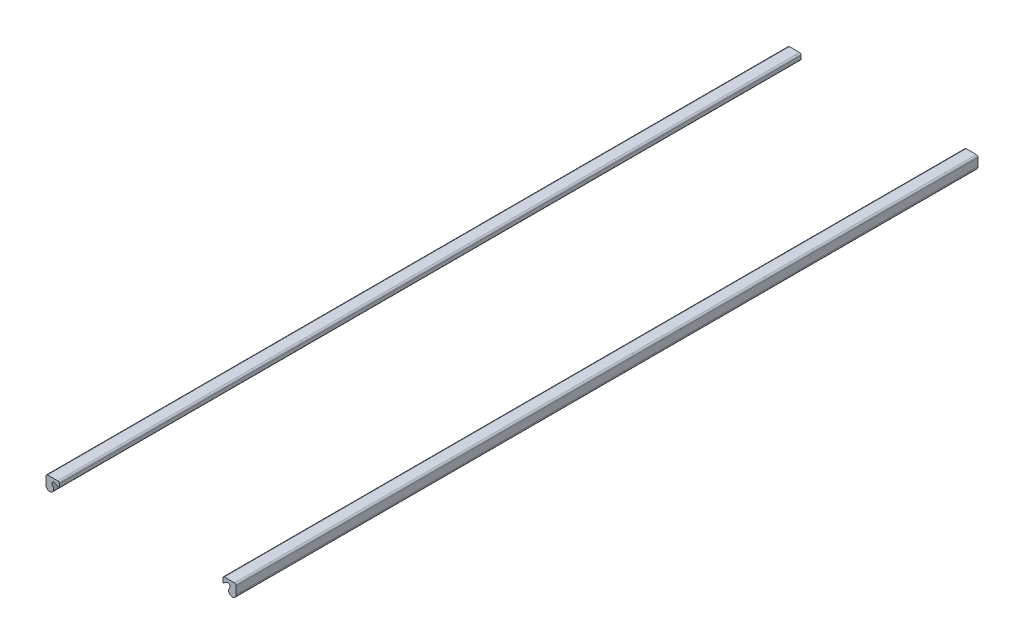
ISO-10303-21;
HEADER;
FILE_DESCRIPTION(('STEP AP214'),'2;1');
FILE_NAME('part.step','',(''),(''),'','','');
FILE_SCHEMA(('AUTOMOTIVE_DESIGN { 1 0 10303 214 1 1 1 1 }'));
ENDSEC;
DATA;
#1=APPLICATION_CONTEXT('core data for automotive mechanical design processes');
#2=APPLICATION_PROTOCOL_DEFINITION('international standard','automotive_design',2000,#1);
#3=PRODUCT_CONTEXT('',#1,'mechanical');
#4=PRODUCT('Part','Part','',(#3));
#5=PRODUCT_RELATED_PRODUCT_CATEGORY('part','',(#4));
#6=PRODUCT_DEFINITION_FORMATION('','',#4);
#7=PRODUCT_DEFINITION_CONTEXT('part definition',#1,'design');
#8=PRODUCT_DEFINITION('design','',#6,#7);
#9=PRODUCT_DEFINITION_SHAPE('','',#8);
#10=(LENGTH_UNIT() NAMED_UNIT(*) SI_UNIT(.MILLI.,.METRE.));
#11=(NAMED_UNIT(*) PLANE_ANGLE_UNIT() SI_UNIT($,.RADIAN.));
#12=(NAMED_UNIT(*) SI_UNIT($,.STERADIAN.) SOLID_ANGLE_UNIT());
#13=UNCERTAINTY_MEASURE_WITH_UNIT(LENGTH_MEASURE(1.E-05),#10,'distance_accuracy_value','');
#14=(GEOMETRIC_REPRESENTATION_CONTEXT(3) GLOBAL_UNCERTAINTY_ASSIGNED_CONTEXT((#13)) GLOBAL_UNIT_ASSIGNED_CONTEXT((#10,
#11,#12)) REPRESENTATION_CONTEXT('',''));
#15=CARTESIAN_POINT('',(0.,0.,0.));
#16=DIRECTION('',(0.,0.,1.));
#17=DIRECTION('',(1.,0.,0.));
#18=AXIS2_PLACEMENT_3D('',#15,#16,#17);
#19=CARTESIAN_POINT('',(6.98,5.18,-27.7));
#20=DIRECTION('',(0.,0.,1.));
#21=DIRECTION('',(1.,0.,0.));
#22=AXIS2_PLACEMENT_3D('',#19,#20,#21);
#23=CYLINDRICAL_SURFACE('',#22,0.12);
#24=CARTESIAN_POINT('',(6.98,5.18,27.7));
#25=DIRECTION('',(0.,0.,1.));
#26=DIRECTION('',(-1.,0.,0.));
#27=AXIS2_PLACEMENT_3D('',#24,#25,#26);
#28=CIRCLE('',#27,0.12);
#29=CARTESIAN_POINT('',(7.1,5.18,27.7));
#30=VERTEX_POINT('',#29);
#31=CARTESIAN_POINT('',(6.98,5.3,27.7));
#32=VERTEX_POINT('',#31);
#33=EDGE_CURVE('E174',#30,#32,#28,.T.);
#34=ORIENTED_EDGE('',*,*,#33,.F.);
#35=DIRECTION('',(0.,0.,1.));
#36=VECTOR('',#35,1.);
#37=CARTESIAN_POINT('',(7.1,5.18,-27.7));
#38=LINE('',#37,#36);
#39=CARTESIAN_POINT('',(7.1,5.18,-27.7));
#40=VERTEX_POINT('',#39);
#41=EDGE_CURVE('E12',#40,#30,#38,.T.);
#42=ORIENTED_EDGE('',*,*,#41,.F.);
#43=CARTESIAN_POINT('',(6.98,5.18,-27.7));
#44=DIRECTION('',(0.,0.,1.));
#45=DIRECTION('',(-1.,0.,0.));
#46=AXIS2_PLACEMENT_3D('',#43,#44,#45);
#47=CIRCLE('',#46,0.12);
#48=CARTESIAN_POINT('',(6.98,5.3,-27.7));
#49=VERTEX_POINT('',#48);
#50=EDGE_CURVE('E185',#40,#49,#47,.T.);
#51=ORIENTED_EDGE('',*,*,#50,.T.);
#52=DIRECTION('',(0.,0.,1.));
#53=VECTOR('',#52,1.);
#54=CARTESIAN_POINT('',(6.98,5.3,-27.7));
#55=LINE('',#54,#53);
#56=EDGE_CURVE('E55',#49,#32,#55,.T.);
#57=ORIENTED_EDGE('',*,*,#56,.T.);
#58=EDGE_LOOP('',(#34,#42,#51,#57));
#59=FACE_BOUND('',#58,.T.);
#60=ADVANCED_FACE('F47',(#59),#23,.T.);
#61=CARTESIAN_POINT('',(7.1,4.58284271247461,-27.7));
#62=DIRECTION('',(1.,0.,0.));
#63=DIRECTION('',(0.,1.,0.));
#64=AXIS2_PLACEMENT_3D('',#61,#62,#63);
#65=PLANE('',#64);
#66=DIRECTION('',(0.,1.,0.));
#67=VECTOR('',#66,1.);
#68=CARTESIAN_POINT('',(7.1,4.58284271247461,27.7));
#69=LINE('',#68,#67);
#70=CARTESIAN_POINT('',(7.1,4.58284271247461,27.7));
#71=VERTEX_POINT('',#70);
#72=EDGE_CURVE('E181',#71,#30,#69,.T.);
#73=ORIENTED_EDGE('',*,*,#72,.F.);
#74=DIRECTION('',(0.,0.,1.));
#75=VECTOR('',#74,1.);
#76=CARTESIAN_POINT('',(7.1,4.58284271247461,-27.7));
#77=LINE('',#76,#75);
#78=CARTESIAN_POINT('',(7.1,4.58284271247461,-27.7));
#79=VERTEX_POINT('',#78);
#80=EDGE_CURVE('E59',#79,#71,#77,.T.);
#81=ORIENTED_EDGE('',*,*,#80,.F.);
#82=DIRECTION('',(0.,1.,0.));
#83=VECTOR('',#82,1.);
#84=CARTESIAN_POINT('',(7.1,4.58284271247461,-27.7));
#85=LINE('',#84,#83);
#86=EDGE_CURVE('E137',#79,#40,#85,.T.);
#87=ORIENTED_EDGE('',*,*,#86,.T.);
#88=ORIENTED_EDGE('',*,*,#41,.T.);
#89=EDGE_LOOP('',(#73,#81,#87,#88));
#90=FACE_BOUND('',#89,.T.);
#91=ADVANCED_FACE('F167',(#90),#65,.T.);
#92=CARTESIAN_POINT('',(6.81715728752539,4.58284271247461,-27.7));
#93=DIRECTION('',(0.,0.,1.));
#94=DIRECTION('',(1.,0.,0.));
#95=AXIS2_PLACEMENT_3D('',#92,#93,#94);
#96=CYLINDRICAL_SURFACE('',#95,0.282842712474614);
#97=CARTESIAN_POINT('',(6.81715728752539,4.58284271247461,27.7));
#98=DIRECTION('',(0.,0.,1.));
#99=DIRECTION('',(1.,0.,0.));
#100=AXIS2_PLACEMENT_3D('',#97,#98,#99);
#101=CIRCLE('',#100,0.282842712474614);
#102=CARTESIAN_POINT('',(6.57812257285704,4.73404590418504,27.7));
#103=VERTEX_POINT('',#102);
#104=EDGE_CURVE('E124',#103,#71,#101,.T.);
#105=ORIENTED_EDGE('',*,*,#104,.F.);
#106=DIRECTION('',(0.,0.,1.));
#107=VECTOR('',#106,1.);
#108=CARTESIAN_POINT('',(6.57812257285704,4.73404590418504,-27.7));
#109=LINE('',#108,#107);
#110=CARTESIAN_POINT('',(6.57812257285704,4.73404590418504,-27.7));
#111=VERTEX_POINT('',#110);
#112=EDGE_CURVE('E117',#111,#103,#109,.T.);
#113=ORIENTED_EDGE('',*,*,#112,.F.);
#114=CARTESIAN_POINT('',(6.81715728752539,4.58284271247461,-27.7));
#115=DIRECTION('',(0.,0.,1.));
#116=DIRECTION('',(1.,0.,0.));
#117=AXIS2_PLACEMENT_3D('',#114,#115,#116);
#118=CIRCLE('',#117,0.282842712474614);
#119=EDGE_CURVE('E122',#111,#79,#118,.T.);
#120=ORIENTED_EDGE('',*,*,#119,.T.);
#121=ORIENTED_EDGE('',*,*,#80,.T.);
#122=EDGE_LOOP('',(#105,#113,#120,#121));
#123=FACE_BOUND('',#122,.T.);
#124=ADVANCED_FACE('F119',(#123),#96,.T.);
#125=CARTESIAN_POINT('',(6.35584262951989,4.77493092469122,-27.7));
#126=DIRECTION('',(0.,0.,-1.));
#127=DIRECTION('',(-0.707106781186541,-0.707106781186554,0.));
#128=AXIS2_PLACEMENT_3D('',#125,#126,#127);
#129=ELLIPSE('',#128,0.35,0.2);
#130=DIRECTION('',(0.,0.,1.));
#131=VECTOR('',#130,1.);
#132=SURFACE_OF_LINEAR_EXTRUSION('',#129,#131);
#133=CARTESIAN_POINT('',(6.35584262951989,4.77493092469122,27.7));
#134=DIRECTION('',(0.,0.,-1.));
#135=DIRECTION('',(-0.707106781186541,-0.707106781186554,0.));
#136=AXIS2_PLACEMENT_3D('',#133,#134,#135);
#137=ELLIPSE('',#136,0.35,0.2);
#138=CARTESIAN_POINT('',(6.18755749223973,4.88770409125084,27.7));
#139=VERTEX_POINT('',#138);
#140=EDGE_CURVE('E187',#139,#103,#137,.T.);
#141=ORIENTED_EDGE('',*,*,#140,.F.);
#142=DIRECTION('',(0.,0.,1.));
#143=VECTOR('',#142,1.);
#144=CARTESIAN_POINT('',(6.18755749223973,4.88770409125084,-27.7));
#145=LINE('',#144,#143);
#146=CARTESIAN_POINT('',(6.18755749223973,4.88770409125084,-27.7));
#147=VERTEX_POINT('',#146);
#148=EDGE_CURVE('E127',#147,#139,#145,.T.);
#149=ORIENTED_EDGE('',*,*,#148,.F.);
#150=EDGE_CURVE('E133',#147,#111,#129,.T.);
#151=ORIENTED_EDGE('',*,*,#150,.T.);
#152=ORIENTED_EDGE('',*,*,#112,.T.);
#153=EDGE_LOOP('',(#141,#149,#151,#152));
#154=FACE_BOUND('',#153,.T.);
#155=ADVANCED_FACE('F139',(#154),#132,.T.);
#156=CARTESIAN_POINT('',(6.15,4.92071067811866,-27.7));
#157=DIRECTION('',(0.,0.,1.));
#158=DIRECTION('',(1.,0.,0.));
#159=AXIS2_PLACEMENT_3D('',#156,#157,#158);
#160=CYLINDRICAL_SURFACE('',#159,0.0500000000000011);
#161=CARTESIAN_POINT('',(6.15,4.92071067811866,27.7));
#162=DIRECTION('',(0.,0.,1.));
#163=DIRECTION('',(1.,0.,0.));
#164=AXIS2_PLACEMENT_3D('',#161,#162,#163);
#165=CIRCLE('',#164,0.0500000000000011);
#166=CARTESIAN_POINT('',(6.1,4.92071067811866,27.7));
#167=VERTEX_POINT('',#166);
#168=EDGE_CURVE('E203',#167,#139,#165,.T.);
#169=ORIENTED_EDGE('',*,*,#168,.F.);
#170=DIRECTION('',(0.,0.,1.));
#171=VECTOR('',#170,1.);
#172=CARTESIAN_POINT('',(6.1,4.92071067811866,-27.7));
#173=LINE('',#172,#171);
#174=CARTESIAN_POINT('',(6.1,4.92071067811866,-27.7));
#175=VERTEX_POINT('',#174);
#176=EDGE_CURVE('E195',#175,#167,#173,.T.);
#177=ORIENTED_EDGE('',*,*,#176,.F.);
#178=CARTESIAN_POINT('',(6.15,4.92071067811866,-27.7));
#179=DIRECTION('',(0.,0.,1.));
#180=DIRECTION('',(1.,0.,0.));
#181=AXIS2_PLACEMENT_3D('',#178,#179,#180);
#182=CIRCLE('',#181,0.0500000000000011);
#183=EDGE_CURVE('E136',#175,#147,#182,.T.);
#184=ORIENTED_EDGE('',*,*,#183,.T.);
#185=ORIENTED_EDGE('',*,*,#148,.T.);
#186=EDGE_LOOP('',(#169,#177,#184,#185));
#187=FACE_BOUND('',#186,.T.);
#188=ADVANCED_FACE('F149',(#187),#160,.T.);
#189=CARTESIAN_POINT('',(6.1,5.18,-27.7));
#190=DIRECTION('',(-1.,0.,0.));
#191=DIRECTION('',(0.,-1.,0.));
#192=AXIS2_PLACEMENT_3D('',#189,#190,#191);
#193=PLANE('',#192);
#194=DIRECTION('',(0.,-1.,0.));
#195=VECTOR('',#194,1.);
#196=CARTESIAN_POINT('',(6.1,5.18,27.7));
#197=LINE('',#196,#195);
#198=CARTESIAN_POINT('',(6.1,5.18,27.7));
#199=VERTEX_POINT('',#198);
#200=EDGE_CURVE('E205',#199,#167,#197,.T.);
#201=ORIENTED_EDGE('',*,*,#200,.F.);
#202=DIRECTION('',(0.,0.,1.));
#203=VECTOR('',#202,1.);
#204=CARTESIAN_POINT('',(6.1,5.18,-27.7));
#205=LINE('',#204,#203);
#206=CARTESIAN_POINT('',(6.1,5.18,-27.7));
#207=VERTEX_POINT('',#206);
#208=EDGE_CURVE('E193',#207,#199,#205,.T.);
#209=ORIENTED_EDGE('',*,*,#208,.F.);
#210=DIRECTION('',(0.,-1.,0.));
#211=VECTOR('',#210,1.);
#212=CARTESIAN_POINT('',(6.1,5.18,-27.7));
#213=LINE('',#212,#211);
#214=EDGE_CURVE('E142',#207,#175,#213,.T.);
#215=ORIENTED_EDGE('',*,*,#214,.T.);
#216=ORIENTED_EDGE('',*,*,#176,.T.);
#217=EDGE_LOOP('',(#201,#209,#215,#216));
#218=FACE_BOUND('',#217,.T.);
#219=ADVANCED_FACE('F155',(#218),#193,.T.);
#220=CARTESIAN_POINT('',(6.22,5.18,-27.7));
#221=DIRECTION('',(0.,0.,1.));
#222=DIRECTION('',(1.,0.,0.));
#223=AXIS2_PLACEMENT_3D('',#220,#221,#222);
#224=CYLINDRICAL_SURFACE('',#223,0.119999999999999);
#225=CARTESIAN_POINT('',(6.22,5.18,27.7));
#226=DIRECTION('',(0.,0.,1.));
#227=DIRECTION('',(-1.,0.,0.));
#228=AXIS2_PLACEMENT_3D('',#225,#226,#227);
#229=CIRCLE('',#228,0.119999999999999);
#230=CARTESIAN_POINT('',(6.22,5.3,27.7));
#231=VERTEX_POINT('',#230);
#232=EDGE_CURVE('E198',#231,#199,#229,.T.);
#233=ORIENTED_EDGE('',*,*,#232,.F.);
#234=DIRECTION('',(0.,0.,1.));
#235=VECTOR('',#234,1.);
#236=CARTESIAN_POINT('',(6.22,5.3,-27.7));
#237=LINE('',#236,#235);
#238=CARTESIAN_POINT('',(6.22,5.3,-27.7));
#239=VERTEX_POINT('',#238);
#240=EDGE_CURVE('E194',#239,#231,#237,.T.);
#241=ORIENTED_EDGE('',*,*,#240,.F.);
#242=CARTESIAN_POINT('',(6.22,5.18,-27.7));
#243=DIRECTION('',(0.,0.,1.));
#244=DIRECTION('',(-1.,0.,0.));
#245=AXIS2_PLACEMENT_3D('',#242,#243,#244);
#246=CIRCLE('',#245,0.119999999999999);
#247=EDGE_CURVE('E212',#239,#207,#246,.T.);
#248=ORIENTED_EDGE('',*,*,#247,.T.);
#249=ORIENTED_EDGE('',*,*,#208,.T.);
#250=EDGE_LOOP('',(#233,#241,#248,#249));
#251=FACE_BOUND('',#250,.T.);
#252=ADVANCED_FACE('F158',(#251),#224,.T.);
#253=CARTESIAN_POINT('',(6.98,5.3,-27.7));
#254=DIRECTION('',(0.,1.,0.));
#255=DIRECTION('',(-1.,0.,0.));
#256=AXIS2_PLACEMENT_3D('',#253,#254,#255);
#257=PLANE('',#256);
#258=DIRECTION('',(-1.,0.,0.));
#259=VECTOR('',#258,1.);
#260=CARTESIAN_POINT('',(6.98,5.3,27.7));
#261=LINE('',#260,#259);
#262=EDGE_CURVE('E177',#32,#231,#261,.T.);
#263=ORIENTED_EDGE('',*,*,#262,.F.);
#264=ORIENTED_EDGE('',*,*,#56,.F.);
#265=DIRECTION('',(-1.,0.,0.));
#266=VECTOR('',#265,1.);
#267=CARTESIAN_POINT('',(6.98,5.3,-27.7));
#268=LINE('',#267,#266);
#269=EDGE_CURVE('E183',#49,#239,#268,.T.);
#270=ORIENTED_EDGE('',*,*,#269,.T.);
#271=ORIENTED_EDGE('',*,*,#240,.T.);
#272=EDGE_LOOP('',(#263,#264,#270,#271));
#273=FACE_BOUND('',#272,.T.);
#274=ADVANCED_FACE('F163',(#273),#257,.T.);
#275=CARTESIAN_POINT('',(6.35584262951989,4.77493092469122,-27.7));
#276=DIRECTION('',(0.,0.,1.));
#277=DIRECTION('',(1.,0.,0.));
#278=AXIS2_PLACEMENT_3D('',#275,#276,#277);
#279=PLANE('',#278);
#280=ORIENTED_EDGE('',*,*,#50,.F.);
#281=ORIENTED_EDGE('',*,*,#86,.F.);
#282=ORIENTED_EDGE('',*,*,#119,.F.);
#283=ORIENTED_EDGE('',*,*,#150,.F.);
#284=ORIENTED_EDGE('',*,*,#183,.F.);
#285=ORIENTED_EDGE('',*,*,#214,.F.);
#286=ORIENTED_EDGE('',*,*,#247,.F.);
#287=ORIENTED_EDGE('',*,*,#269,.F.);
#288=EDGE_LOOP('',(#280,#281,#282,#283,#284,#285,#286,#287));
#289=FACE_BOUND('',#288,.T.);
#290=ADVANCED_FACE('F132',(#289),#279,.F.);
#291=CARTESIAN_POINT('',(6.35584262951989,4.77493092469122,27.7));
#292=DIRECTION('',(0.,0.,1.));
#293=DIRECTION('',(1.,0.,0.));
#294=AXIS2_PLACEMENT_3D('',#291,#292,#293);
#295=PLANE('',#294);
#296=ORIENTED_EDGE('',*,*,#33,.T.);
#297=ORIENTED_EDGE('',*,*,#262,.T.);
#298=ORIENTED_EDGE('',*,*,#232,.T.);
#299=ORIENTED_EDGE('',*,*,#200,.T.);
#300=ORIENTED_EDGE('',*,*,#168,.T.);
#301=ORIENTED_EDGE('',*,*,#140,.T.);
#302=ORIENTED_EDGE('',*,*,#104,.T.);
#303=ORIENTED_EDGE('',*,*,#72,.T.);
#304=EDGE_LOOP('',(#296,#297,#298,#299,#300,#301,#302,#303));
#305=FACE_BOUND('',#304,.T.);
#306=ADVANCED_FACE('F170',(#305),#295,.T.);
#307=CLOSED_SHELL('',(#60,#91,#124,#155,#188,#219,#252,#274,#290,#306));
#308=MANIFOLD_SOLID_BREP('B2',#307);
#309=CARTESIAN_POINT('',(-6.15,4.92071067811866,-27.7));
#310=DIRECTION('',(0.,0.,1.));
#311=DIRECTION('',(1.,0.,0.));
#312=AXIS2_PLACEMENT_3D('',#309,#310,#311);
#313=CYLINDRICAL_SURFACE('',#312,0.0500000000000011);
#314=CARTESIAN_POINT('',(-6.15,4.92071067811866,27.7));
#315=DIRECTION('',(0.,0.,1.));
#316=DIRECTION('',(-1.,0.,0.));
#317=AXIS2_PLACEMENT_3D('',#314,#315,#316);
#318=CIRCLE('',#317,0.0500000000000011);
#319=CARTESIAN_POINT('',(-6.18755749223973,4.88770409125084,27.7));
#320=VERTEX_POINT('',#319);
#321=CARTESIAN_POINT('',(-6.1,4.92071067811866,27.7));
#322=VERTEX_POINT('',#321);
#323=EDGE_CURVE('E358',#320,#322,#318,.T.);
#324=ORIENTED_EDGE('',*,*,#323,.F.);
#325=DIRECTION('',(0.,0.,1.));
#326=VECTOR('',#325,1.);
#327=CARTESIAN_POINT('',(-6.18755749223973,4.88770409125084,-27.7));
#328=LINE('',#327,#326);
#329=CARTESIAN_POINT('',(-6.18755749223973,4.88770409125084,-27.7));
#330=VERTEX_POINT('',#329);
#331=EDGE_CURVE('E50',#330,#320,#328,.T.);
#332=ORIENTED_EDGE('',*,*,#331,.F.);
#333=CARTESIAN_POINT('',(-6.15,4.92071067811866,-27.7));
#334=DIRECTION('',(0.,0.,1.));
#335=DIRECTION('',(-1.,0.,0.));
#336=AXIS2_PLACEMENT_3D('',#333,#334,#335);
#337=CIRCLE('',#336,0.0500000000000011);
#338=CARTESIAN_POINT('',(-6.1,4.92071067811866,-27.7));
#339=VERTEX_POINT('',#338);
#340=EDGE_CURVE('E393',#330,#339,#337,.T.);
#341=ORIENTED_EDGE('',*,*,#340,.T.);
#342=DIRECTION('',(0.,0.,1.));
#343=VECTOR('',#342,1.);
#344=CARTESIAN_POINT('',(-6.1,4.92071067811866,-27.7));
#345=LINE('',#344,#343);
#346=EDGE_CURVE('E261',#339,#322,#345,.T.);
#347=ORIENTED_EDGE('',*,*,#346,.T.);
#348=EDGE_LOOP('',(#324,#332,#341,#347));
#349=FACE_BOUND('',#348,.T.);
#350=ADVANCED_FACE('F257',(#349),#313,.T.);
#351=CARTESIAN_POINT('',(-6.35584262951989,4.77493092469122,-27.7));
#352=DIRECTION('',(0.,0.,-1.));
#353=DIRECTION('',(0.707106781186541,-0.707106781186554,0.));
#354=AXIS2_PLACEMENT_3D('',#351,#352,#353);
#355=ELLIPSE('',#354,0.35,0.2);
#356=DIRECTION('',(0.,0.,1.));
#357=VECTOR('',#356,1.);
#358=SURFACE_OF_LINEAR_EXTRUSION('',#355,#357);
#359=CARTESIAN_POINT('',(-6.35584262951989,4.77493092469122,27.7));
#360=DIRECTION('',(0.,0.,-1.));
#361=DIRECTION('',(0.707106781186541,-0.707106781186554,0.));
#362=AXIS2_PLACEMENT_3D('',#359,#360,#361);
#363=ELLIPSE('',#362,0.35,0.2);
#364=CARTESIAN_POINT('',(-6.57812257285704,4.73404590418504,27.7));
#365=VERTEX_POINT('',#364);
#366=EDGE_CURVE('E394',#365,#320,#363,.T.);
#367=ORIENTED_EDGE('',*,*,#366,.F.);
#368=DIRECTION('',(0.,0.,1.));
#369=VECTOR('',#368,1.);
#370=CARTESIAN_POINT('',(-6.57812257285704,4.73404590418504,-27.7));
#371=LINE('',#370,#369);
#372=CARTESIAN_POINT('',(-6.57812257285704,4.73404590418504,-27.7));
#373=VERTEX_POINT('',#372);
#374=EDGE_CURVE('E270',#373,#365,#371,.T.);
#375=ORIENTED_EDGE('',*,*,#374,.F.);
#376=EDGE_CURVE('E344',#373,#330,#355,.T.);
#377=ORIENTED_EDGE('',*,*,#376,.T.);
#378=ORIENTED_EDGE('',*,*,#331,.T.);
#379=EDGE_LOOP('',(#367,#375,#377,#378));
#380=FACE_BOUND('',#379,.T.);
#381=ADVANCED_FACE('F360',(#380),#358,.T.);
#382=CARTESIAN_POINT('',(-6.81715728752539,4.58284271247461,-27.7));
#383=DIRECTION('',(0.,0.,1.));
#384=DIRECTION('',(1.,0.,0.));
#385=AXIS2_PLACEMENT_3D('',#382,#383,#384);
#386=CYLINDRICAL_SURFACE('',#385,0.282842712474614);
#387=CARTESIAN_POINT('',(-6.81715728752539,4.58284271247461,27.7));
#388=DIRECTION('',(0.,0.,1.));
#389=DIRECTION('',(-1.,0.,0.));
#390=AXIS2_PLACEMENT_3D('',#387,#388,#389);
#391=CIRCLE('',#390,0.282842712474614);
#392=CARTESIAN_POINT('',(-7.1,4.58284271247461,27.7));
#393=VERTEX_POINT('',#392);
#394=EDGE_CURVE('E335',#393,#365,#391,.T.);
#395=ORIENTED_EDGE('',*,*,#394,.F.);
#396=DIRECTION('',(0.,0.,1.));
#397=VECTOR('',#396,1.);
#398=CARTESIAN_POINT('',(-7.1,4.58284271247461,-27.7));
#399=LINE('',#398,#397);
#400=CARTESIAN_POINT('',(-7.1,4.58284271247461,-27.7));
#401=VERTEX_POINT('',#400);
#402=EDGE_CURVE('E327',#401,#393,#399,.T.);
#403=ORIENTED_EDGE('',*,*,#402,.F.);
#404=CARTESIAN_POINT('',(-6.81715728752539,4.58284271247461,-27.7));
#405=DIRECTION('',(0.,0.,1.));
#406=DIRECTION('',(-1.,0.,0.));
#407=AXIS2_PLACEMENT_3D('',#404,#405,#406);
#408=CIRCLE('',#407,0.282842712474614);
#409=EDGE_CURVE('E330',#401,#373,#408,.T.);
#410=ORIENTED_EDGE('',*,*,#409,.T.);
#411=ORIENTED_EDGE('',*,*,#374,.T.);
#412=EDGE_LOOP('',(#395,#403,#410,#411));
#413=FACE_BOUND('',#412,.T.);
#414=ADVANCED_FACE('F328',(#413),#386,.T.);
#415=CARTESIAN_POINT('',(-7.1,4.58284271247461,-27.7));
#416=DIRECTION('',(-1.,0.,0.));
#417=DIRECTION('',(0.,-1.,0.));
#418=AXIS2_PLACEMENT_3D('',#415,#416,#417);
#419=PLANE('',#418);
#420=DIRECTION('',(0.,-1.,0.));
#421=VECTOR('',#420,1.);
#422=CARTESIAN_POINT('',(-7.1,4.58284271247461,27.7));
#423=LINE('',#422,#421);
#424=CARTESIAN_POINT('',(-7.1,5.18,27.7));
#425=VERTEX_POINT('',#424);
#426=EDGE_CURVE('E399',#425,#393,#423,.T.);
#427=ORIENTED_EDGE('',*,*,#426,.F.);
#428=DIRECTION('',(0.,0.,1.));
#429=VECTOR('',#428,1.);
#430=CARTESIAN_POINT('',(-7.1,5.18,-27.7));
#431=LINE('',#430,#429);
#432=CARTESIAN_POINT('',(-7.1,5.18,-27.7));
#433=VERTEX_POINT('',#432);
#434=EDGE_CURVE('E340',#433,#425,#431,.T.);
#435=ORIENTED_EDGE('',*,*,#434,.F.);
#436=DIRECTION('',(0.,-1.,0.));
#437=VECTOR('',#436,1.);
#438=CARTESIAN_POINT('',(-7.1,4.58284271247461,-27.7));
#439=LINE('',#438,#437);
#440=EDGE_CURVE('E342',#433,#401,#439,.T.);
#441=ORIENTED_EDGE('',*,*,#440,.T.);
#442=ORIENTED_EDGE('',*,*,#402,.T.);
#443=EDGE_LOOP('',(#427,#435,#441,#442));
#444=FACE_BOUND('',#443,.T.);
#445=ADVANCED_FACE('F349',(#444),#419,.T.);
#446=CARTESIAN_POINT('',(-6.98,5.18,-27.7));
#447=DIRECTION('',(0.,0.,1.));
#448=DIRECTION('',(1.,0.,0.));
#449=AXIS2_PLACEMENT_3D('',#446,#447,#448);
#450=CYLINDRICAL_SURFACE('',#449,0.12);
#451=CARTESIAN_POINT('',(-6.98,5.18,27.7));
#452=DIRECTION('',(0.,0.,1.));
#453=DIRECTION('',(1.,0.,0.));
#454=AXIS2_PLACEMENT_3D('',#451,#452,#453);
#455=CIRCLE('',#454,0.12);
#456=CARTESIAN_POINT('',(-6.98,5.3,27.7));
#457=VERTEX_POINT('',#456);
#458=EDGE_CURVE('E419',#457,#425,#455,.T.);
#459=ORIENTED_EDGE('',*,*,#458,.F.);
#460=DIRECTION('',(0.,0.,1.));
#461=VECTOR('',#460,1.);
#462=CARTESIAN_POINT('',(-6.98,5.3,-27.7));
#463=LINE('',#462,#461);
#464=CARTESIAN_POINT('',(-6.98,5.3,-27.7));
#465=VERTEX_POINT('',#464);
#466=EDGE_CURVE('E404',#465,#457,#463,.T.);
#467=ORIENTED_EDGE('',*,*,#466,.F.);
#468=CARTESIAN_POINT('',(-6.98,5.18,-27.7));
#469=DIRECTION('',(0.,0.,1.));
#470=DIRECTION('',(1.,0.,0.));
#471=AXIS2_PLACEMENT_3D('',#468,#469,#470);
#472=CIRCLE('',#471,0.12);
#473=EDGE_CURVE('E347',#465,#433,#472,.T.);
#474=ORIENTED_EDGE('',*,*,#473,.T.);
#475=ORIENTED_EDGE('',*,*,#434,.T.);
#476=EDGE_LOOP('',(#459,#467,#474,#475));
#477=FACE_BOUND('',#476,.T.);
#478=ADVANCED_FACE('F367',(#477),#450,.T.);
#479=CARTESIAN_POINT('',(-6.98,5.3,-27.7));
#480=DIRECTION('',(0.,1.,0.));
#481=DIRECTION('',(-1.,0.,0.));
#482=AXIS2_PLACEMENT_3D('',#479,#480,#481);
#483=PLANE('',#482);
#484=DIRECTION('',(-1.,0.,0.));
#485=VECTOR('',#484,1.);
#486=CARTESIAN_POINT('',(-6.98,5.3,27.7));
#487=LINE('',#486,#485);
#488=CARTESIAN_POINT('',(-6.22,5.3,27.7));
#489=VERTEX_POINT('',#488);
#490=EDGE_CURVE('E411',#489,#457,#487,.T.);
#491=ORIENTED_EDGE('',*,*,#490,.F.);
#492=DIRECTION('',(0.,0.,1.));
#493=VECTOR('',#492,1.);
#494=CARTESIAN_POINT('',(-6.22,5.3,-27.7));
#495=LINE('',#494,#493);
#496=CARTESIAN_POINT('',(-6.22,5.3,-27.7));
#497=VERTEX_POINT('',#496);
#498=EDGE_CURVE('E406',#497,#489,#495,.T.);
#499=ORIENTED_EDGE('',*,*,#498,.F.);
#500=DIRECTION('',(-1.,0.,0.));
#501=VECTOR('',#500,1.);
#502=CARTESIAN_POINT('',(-6.98,5.3,-27.7));
#503=LINE('',#502,#501);
#504=EDGE_CURVE('E346',#497,#465,#503,.T.);
#505=ORIENTED_EDGE('',*,*,#504,.T.);
#506=ORIENTED_EDGE('',*,*,#466,.T.);
#507=EDGE_LOOP('',(#491,#499,#505,#506));
#508=FACE_BOUND('',#507,.T.);
#509=ADVANCED_FACE('F375',(#508),#483,.T.);
#510=CARTESIAN_POINT('',(-6.22,5.18,-27.7));
#511=DIRECTION('',(0.,0.,1.));
#512=DIRECTION('',(1.,0.,0.));
#513=AXIS2_PLACEMENT_3D('',#510,#511,#512);
#514=CYLINDRICAL_SURFACE('',#513,0.119999999999999);
#515=CARTESIAN_POINT('',(-6.22,5.18,27.7));
#516=DIRECTION('',(0.,0.,1.));
#517=DIRECTION('',(1.,0.,0.));
#518=AXIS2_PLACEMENT_3D('',#515,#516,#517);
#519=CIRCLE('',#518,0.119999999999999);
#520=CARTESIAN_POINT('',(-6.1,5.18,27.7));
#521=VERTEX_POINT('',#520);
#522=EDGE_CURVE('E414',#521,#489,#519,.T.);
#523=ORIENTED_EDGE('',*,*,#522,.F.);
#524=DIRECTION('',(0.,0.,1.));
#525=VECTOR('',#524,1.);
#526=CARTESIAN_POINT('',(-6.1,5.18,-27.7));
#527=LINE('',#526,#525);
#528=CARTESIAN_POINT('',(-6.1,5.18,-27.7));
#529=VERTEX_POINT('',#528);
#530=EDGE_CURVE('E410',#529,#521,#527,.T.);
#531=ORIENTED_EDGE('',*,*,#530,.F.);
#532=CARTESIAN_POINT('',(-6.22,5.18,-27.7));
#533=DIRECTION('',(0.,0.,1.));
#534=DIRECTION('',(1.,0.,0.));
#535=AXIS2_PLACEMENT_3D('',#532,#533,#534);
#536=CIRCLE('',#535,0.119999999999999);
#537=EDGE_CURVE('E425',#529,#497,#536,.T.);
#538=ORIENTED_EDGE('',*,*,#537,.T.);
#539=ORIENTED_EDGE('',*,*,#498,.T.);
#540=EDGE_LOOP('',(#523,#531,#538,#539));
#541=FACE_BOUND('',#540,.T.);
#542=ADVANCED_FACE('F376',(#541),#514,.T.);
#543=CARTESIAN_POINT('',(-6.1,5.18,-27.7));
#544=DIRECTION('',(1.,0.,0.));
#545=DIRECTION('',(0.,1.,0.));
#546=AXIS2_PLACEMENT_3D('',#543,#544,#545);
#547=PLANE('',#546);
#548=DIRECTION('',(0.,1.,0.));
#549=VECTOR('',#548,1.);
#550=CARTESIAN_POINT('',(-6.1,5.18,27.7));
#551=LINE('',#550,#549);
#552=EDGE_CURVE('E392',#322,#521,#551,.T.);
#553=ORIENTED_EDGE('',*,*,#552,.F.);
#554=ORIENTED_EDGE('',*,*,#346,.F.);
#555=DIRECTION('',(0.,1.,0.));
#556=VECTOR('',#555,1.);
#557=CARTESIAN_POINT('',(-6.1,5.18,-27.7));
#558=LINE('',#557,#556);
#559=EDGE_CURVE('E397',#339,#529,#558,.T.);
#560=ORIENTED_EDGE('',*,*,#559,.T.);
#561=ORIENTED_EDGE('',*,*,#530,.T.);
#562=EDGE_LOOP('',(#553,#554,#560,#561));
#563=FACE_BOUND('',#562,.T.);
#564=ADVANCED_FACE('F378',(#563),#547,.T.);
#565=CARTESIAN_POINT('',(-6.35584262951989,4.77493092469122,-27.7));
#566=DIRECTION('',(0.,0.,-1.));
#567=DIRECTION('',(-1.,0.,0.));
#568=AXIS2_PLACEMENT_3D('',#565,#566,#567);
#569=PLANE('',#568);
#570=ORIENTED_EDGE('',*,*,#340,.F.);
#571=ORIENTED_EDGE('',*,*,#376,.F.);
#572=ORIENTED_EDGE('',*,*,#409,.F.);
#573=ORIENTED_EDGE('',*,*,#440,.F.);
#574=ORIENTED_EDGE('',*,*,#473,.F.);
#575=ORIENTED_EDGE('',*,*,#504,.F.);
#576=ORIENTED_EDGE('',*,*,#537,.F.);
#577=ORIENTED_EDGE('',*,*,#559,.F.);
#578=EDGE_LOOP('',(#570,#571,#572,#573,#574,#575,#576,#577));
#579=FACE_BOUND('',#578,.T.);
#580=ADVANCED_FACE('F341',(#579),#569,.T.);
#581=CARTESIAN_POINT('',(-6.35584262951989,4.77493092469122,27.7));
#582=DIRECTION('',(0.,0.,-1.));
#583=DIRECTION('',(-1.,0.,0.));
#584=AXIS2_PLACEMENT_3D('',#581,#582,#583);
#585=PLANE('',#584);
#586=ORIENTED_EDGE('',*,*,#323,.T.);
#587=ORIENTED_EDGE('',*,*,#552,.T.);
#588=ORIENTED_EDGE('',*,*,#522,.T.);
#589=ORIENTED_EDGE('',*,*,#490,.T.);
#590=ORIENTED_EDGE('',*,*,#458,.T.);
#591=ORIENTED_EDGE('',*,*,#426,.T.);
#592=ORIENTED_EDGE('',*,*,#394,.T.);
#593=ORIENTED_EDGE('',*,*,#366,.T.);
#594=EDGE_LOOP('',(#586,#587,#588,#589,#590,#591,#592,#593));
#595=FACE_BOUND('',#594,.T.);
#596=ADVANCED_FACE('F361',(#595),#585,.F.);
#597=CLOSED_SHELL('',(#350,#381,#414,#445,#478,#509,#542,#564,#580,#596));
#598=MANIFOLD_SOLID_BREP('B6',#597);
#599=ADVANCED_BREP_SHAPE_REPRESENTATION('',(#18,#308,#598),#14);
#600=SHAPE_DEFINITION_REPRESENTATION(#9,#599);
ENDSEC;
END-ISO-10303-21;
